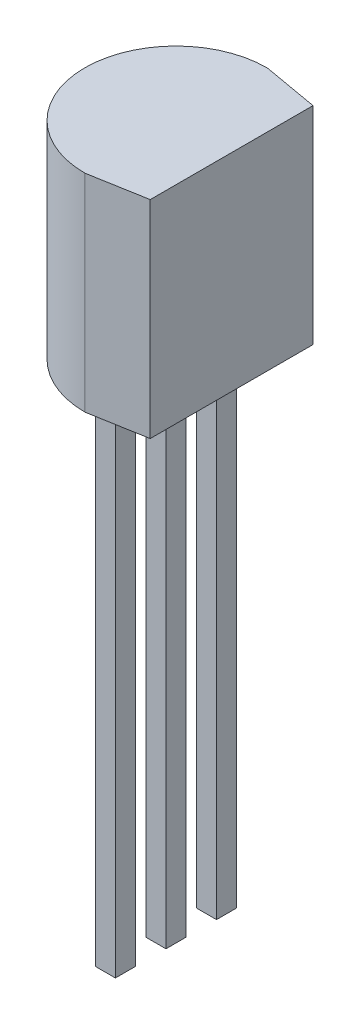
ISO-10303-21;
HEADER;
FILE_DESCRIPTION(('STEP AP214'),'2;1');
FILE_NAME('part.step','',(''),(''),'','','');
FILE_SCHEMA(('AUTOMOTIVE_DESIGN { 1 0 10303 214 1 1 1 1 }'));
ENDSEC;
DATA;
#1=APPLICATION_CONTEXT('core data for automotive mechanical design processes');
#2=APPLICATION_PROTOCOL_DEFINITION('international standard','automotive_design',2000,#1);
#3=PRODUCT_CONTEXT('',#1,'mechanical');
#4=PRODUCT('Part','Part','',(#3));
#5=PRODUCT_RELATED_PRODUCT_CATEGORY('part','',(#4));
#6=PRODUCT_DEFINITION_FORMATION('','',#4);
#7=PRODUCT_DEFINITION_CONTEXT('part definition',#1,'design');
#8=PRODUCT_DEFINITION('design','',#6,#7);
#9=PRODUCT_DEFINITION_SHAPE('','',#8);
#10=(LENGTH_UNIT() NAMED_UNIT(*) SI_UNIT(.MILLI.,.METRE.));
#11=(NAMED_UNIT(*) PLANE_ANGLE_UNIT() SI_UNIT($,.RADIAN.));
#12=(NAMED_UNIT(*) SI_UNIT($,.STERADIAN.) SOLID_ANGLE_UNIT());
#13=UNCERTAINTY_MEASURE_WITH_UNIT(LENGTH_MEASURE(1.E-05),#10,'distance_accuracy_value','');
#14=(GEOMETRIC_REPRESENTATION_CONTEXT(3) GLOBAL_UNCERTAINTY_ASSIGNED_CONTEXT((#13)) GLOBAL_UNIT_ASSIGNED_CONTEXT((#10,
#11,#12)) REPRESENTATION_CONTEXT('',''));
#15=CARTESIAN_POINT('',(0.,0.,0.));
#16=DIRECTION('',(0.,0.,1.));
#17=DIRECTION('',(1.,0.,0.));
#18=AXIS2_PLACEMENT_3D('',#15,#16,#17);
#19=CARTESIAN_POINT('',(0.,5.2,0.));
#20=DIRECTION('',(0.,-1.,0.));
#21=DIRECTION('',(0.,0.,-1.));
#22=AXIS2_PLACEMENT_3D('',#19,#20,#21);
#23=CYLINDRICAL_SURFACE('',#22,2.29);
#24=CARTESIAN_POINT('',(0.,0.,0.));
#25=DIRECTION('',(0.,1.,0.));
#26=DIRECTION('',(0.,0.,1.));
#27=AXIS2_PLACEMENT_3D('',#24,#25,#26);
#28=CIRCLE('',#27,2.29);
#29=CARTESIAN_POINT('',(0.,0.,-2.29));
#30=VERTEX_POINT('',#29);
#31=CARTESIAN_POINT('',(0.,0.,2.29));
#32=VERTEX_POINT('',#31);
#33=EDGE_CURVE('E298',#30,#32,#28,.T.);
#34=ORIENTED_EDGE('',*,*,#33,.T.);
#35=DIRECTION('',(0.,-1.,0.));
#36=VECTOR('',#35,1.);
#37=CARTESIAN_POINT('',(0.,5.2,2.29));
#38=LINE('',#37,#36);
#39=CARTESIAN_POINT('',(0.,5.2,2.29));
#40=VERTEX_POINT('',#39);
#41=EDGE_CURVE('E44',#40,#32,#38,.T.);
#42=ORIENTED_EDGE('',*,*,#41,.F.);
#43=CARTESIAN_POINT('',(0.,5.2,0.));
#44=DIRECTION('',(0.,1.,0.));
#45=DIRECTION('',(0.,0.,1.));
#46=AXIS2_PLACEMENT_3D('',#43,#44,#45);
#47=CIRCLE('',#46,2.29);
#48=CARTESIAN_POINT('',(0.,5.2,-2.29));
#49=VERTEX_POINT('',#48);
#50=EDGE_CURVE('E299',#49,#40,#47,.T.);
#51=ORIENTED_EDGE('',*,*,#50,.F.);
#52=DIRECTION('',(0.,-1.,0.));
#53=VECTOR('',#52,1.);
#54=CARTESIAN_POINT('',(0.,5.2,-2.29));
#55=LINE('',#54,#53);
#56=EDGE_CURVE('E11',#49,#30,#55,.T.);
#57=ORIENTED_EDGE('',*,*,#56,.T.);
#58=EDGE_LOOP('',(#34,#42,#51,#57));
#59=FACE_BOUND('',#58,.T.);
#60=ADVANCED_FACE('F37',(#59),#23,.T.);
#61=CARTESIAN_POINT('',(-5.1611850113347,5.2,0.));
#62=DIRECTION('',(0.,1.,0.));
#63=DIRECTION('',(0.,0.,1.));
#64=AXIS2_PLACEMENT_3D('',#61,#62,#63);
#65=PLANE('',#64);
#66=ORIENTED_EDGE('',*,*,#50,.T.);
#67=DIRECTION('',(1.,0.,0.));
#68=VECTOR('',#67,1.);
#69=CARTESIAN_POINT('',(-5.1611850113347,5.2,2.29));
#70=LINE('',#69,#68);
#71=CARTESIAN_POINT('',(0.0100000000000005,5.2,2.29));
#72=VERTEX_POINT('',#71);
#73=EDGE_CURVE('E273',#40,#72,#70,.T.);
#74=ORIENTED_EDGE('',*,*,#73,.T.);
#75=DIRECTION('',(0.984807753012208,0.,-0.17364817766693));
#76=VECTOR('',#75,1.);
#77=CARTESIAN_POINT('',(-4.61364163949441,5.2,3.10527277016999));
#78=LINE('',#77,#76);
#79=CARTESIAN_POINT('',(1.4,5.2,2.04490549681523));
#80=VERTEX_POINT('',#79);
#81=EDGE_CURVE('E275',#72,#80,#78,.T.);
#82=ORIENTED_EDGE('',*,*,#81,.T.);
#83=DIRECTION('',(0.,0.,1.));
#84=VECTOR('',#83,1.);
#85=CARTESIAN_POINT('',(1.4,5.2,0.));
#86=LINE('',#85,#84);
#87=CARTESIAN_POINT('',(1.4,5.2,-2.04490549681523));
#88=VERTEX_POINT('',#87);
#89=EDGE_CURVE('E263',#88,#80,#86,.T.);
#90=ORIENTED_EDGE('',*,*,#89,.F.);
#91=DIRECTION('',(0.984807753012208,0.,0.17364817766693));
#92=VECTOR('',#91,1.);
#93=CARTESIAN_POINT('',(-4.61364163949441,5.2,-3.10527277016999));
#94=LINE('',#93,#92);
#95=CARTESIAN_POINT('',(0.0100000000000005,5.2,-2.29));
#96=VERTEX_POINT('',#95);
#97=EDGE_CURVE('E266',#96,#88,#94,.T.);
#98=ORIENTED_EDGE('',*,*,#97,.F.);
#99=DIRECTION('',(1.,0.,0.));
#100=VECTOR('',#99,1.);
#101=CARTESIAN_POINT('',(-5.1611850113347,5.2,-2.29));
#102=LINE('',#101,#100);
#103=EDGE_CURVE('E270',#49,#96,#102,.T.);
#104=ORIENTED_EDGE('',*,*,#103,.F.);
#105=EDGE_LOOP('',(#66,#74,#82,#90,#98,#104));
#106=FACE_BOUND('',#105,.T.);
#107=ADVANCED_FACE('F321',(#106),#65,.T.);
#108=CARTESIAN_POINT('',(-5.1611850113347,0.,0.));
#109=DIRECTION('',(0.,1.,0.));
#110=DIRECTION('',(0.,0.,1.));
#111=AXIS2_PLACEMENT_3D('',#108,#109,#110);
#112=PLANE('',#111);
#113=DIRECTION('',(1.,0.,0.));
#114=VECTOR('',#113,1.);
#115=CARTESIAN_POINT('',(-0.444999999999998,0.,1.52));
#116=LINE('',#115,#114);
#117=CARTESIAN_POINT('',(-0.500000000000005,0.,1.52));
#118=VERTEX_POINT('',#117);
#119=CARTESIAN_POINT('',(0.,0.,1.52));
#120=VERTEX_POINT('',#119);
#121=EDGE_CURVE('E51',#118,#120,#116,.T.);
#122=ORIENTED_EDGE('',*,*,#121,.T.);
#123=DIRECTION('',(0.,0.,-1.));
#124=VECTOR('',#123,1.);
#125=CARTESIAN_POINT('',(0.,0.,-4.7161850113347));
#126=LINE('',#125,#124);
#127=CARTESIAN_POINT('',(0.,0.,1.02));
#128=VERTEX_POINT('',#127);
#129=EDGE_CURVE('E165',#120,#128,#126,.T.);
#130=ORIENTED_EDGE('',*,*,#129,.T.);
#131=DIRECTION('',(1.,0.,0.));
#132=VECTOR('',#131,1.);
#133=CARTESIAN_POINT('',(-0.444999999999998,0.,1.02));
#134=LINE('',#133,#132);
#135=CARTESIAN_POINT('',(-0.500000000000005,0.,1.02));
#136=VERTEX_POINT('',#135);
#137=EDGE_CURVE('E180',#136,#128,#134,.T.);
#138=ORIENTED_EDGE('',*,*,#137,.F.);
#139=DIRECTION('',(0.,0.,1.));
#140=VECTOR('',#139,1.);
#141=CARTESIAN_POINT('',(-0.500000000000004,0.,-4.7161850113347));
#142=LINE('',#141,#140);
#143=EDGE_CURVE('E56',#136,#118,#142,.T.);
#144=ORIENTED_EDGE('',*,*,#143,.T.);
#145=EDGE_LOOP('',(#122,#130,#138,#144));
#146=FACE_BOUND('',#145,.T.);
#147=DIRECTION('',(1.,0.,0.));
#148=VECTOR('',#147,1.);
#149=CARTESIAN_POINT('',(-0.444999999999998,0.,0.25));
#150=LINE('',#149,#148);
#151=CARTESIAN_POINT('',(-0.5,0.,0.25));
#152=VERTEX_POINT('',#151);
#153=CARTESIAN_POINT('',(0.,0.,0.25));
#154=VERTEX_POINT('',#153);
#155=EDGE_CURVE('E213',#152,#154,#150,.T.);
#156=ORIENTED_EDGE('',*,*,#155,.T.);
#157=DIRECTION('',(0.,0.,-1.));
#158=VECTOR('',#157,1.);
#159=CARTESIAN_POINT('',(0.,0.,-4.7161850113347));
#160=LINE('',#159,#158);
#161=CARTESIAN_POINT('',(0.,0.,-0.25));
#162=VERTEX_POINT('',#161);
#163=EDGE_CURVE('E168',#154,#162,#160,.T.);
#164=ORIENTED_EDGE('',*,*,#163,.T.);
#165=DIRECTION('',(1.,0.,0.));
#166=VECTOR('',#165,1.);
#167=CARTESIAN_POINT('',(-0.444999999999998,0.,-0.25));
#168=LINE('',#167,#166);
#169=CARTESIAN_POINT('',(-0.5,0.,-0.25));
#170=VERTEX_POINT('',#169);
#171=EDGE_CURVE('E203',#170,#162,#168,.T.);
#172=ORIENTED_EDGE('',*,*,#171,.F.);
#173=DIRECTION('',(0.,0.,1.));
#174=VECTOR('',#173,1.);
#175=CARTESIAN_POINT('',(-0.5,0.,-4.7161850113347));
#176=LINE('',#175,#174);
#177=EDGE_CURVE('E215',#170,#152,#176,.T.);
#178=ORIENTED_EDGE('',*,*,#177,.T.);
#179=EDGE_LOOP('',(#156,#164,#172,#178));
#180=FACE_BOUND('',#179,.T.);
#181=DIRECTION('',(1.,0.,0.));
#182=VECTOR('',#181,1.);
#183=CARTESIAN_POINT('',(-0.444999999999998,0.,-1.02));
#184=LINE('',#183,#182);
#185=CARTESIAN_POINT('',(-0.499999999999987,0.,-1.02));
#186=VERTEX_POINT('',#185);
#187=CARTESIAN_POINT('',(0.,0.,-1.02));
#188=VERTEX_POINT('',#187);
#189=EDGE_CURVE('E245',#186,#188,#184,.T.);
#190=ORIENTED_EDGE('',*,*,#189,.T.);
#191=DIRECTION('',(0.,0.,-1.));
#192=VECTOR('',#191,1.);
#193=CARTESIAN_POINT('',(0.,0.,-4.7161850113347));
#194=LINE('',#193,#192);
#195=CARTESIAN_POINT('',(0.,0.,-1.52));
#196=VERTEX_POINT('',#195);
#197=EDGE_CURVE('E230',#188,#196,#194,.T.);
#198=ORIENTED_EDGE('',*,*,#197,.T.);
#199=DIRECTION('',(1.,0.,0.));
#200=VECTOR('',#199,1.);
#201=CARTESIAN_POINT('',(-0.444999999999998,0.,-1.52));
#202=LINE('',#201,#200);
#203=CARTESIAN_POINT('',(-0.499999999999987,0.,-1.52));
#204=VERTEX_POINT('',#203);
#205=EDGE_CURVE('E235',#204,#196,#202,.T.);
#206=ORIENTED_EDGE('',*,*,#205,.F.);
#207=DIRECTION('',(0.,0.,1.));
#208=VECTOR('',#207,1.);
#209=CARTESIAN_POINT('',(-0.499999999999987,0.,-4.7161850113347));
#210=LINE('',#209,#208);
#211=EDGE_CURVE('E247',#204,#186,#210,.T.);
#212=ORIENTED_EDGE('',*,*,#211,.T.);
#213=EDGE_LOOP('',(#190,#198,#206,#212));
#214=FACE_BOUND('',#213,.T.);
#215=ORIENTED_EDGE('',*,*,#33,.F.);
#216=DIRECTION('',(1.,0.,0.));
#217=VECTOR('',#216,1.);
#218=CARTESIAN_POINT('',(-5.1611850113347,0.,-2.29));
#219=LINE('',#218,#217);
#220=CARTESIAN_POINT('',(0.0100000000000005,0.,-2.29));
#221=VERTEX_POINT('',#220);
#222=EDGE_CURVE('E283',#30,#221,#219,.T.);
#223=ORIENTED_EDGE('',*,*,#222,.T.);
#224=DIRECTION('',(0.984807753012208,0.,0.17364817766693));
#225=VECTOR('',#224,1.);
#226=CARTESIAN_POINT('',(-4.61364163949441,0.,-3.10527277016999));
#227=LINE('',#226,#225);
#228=CARTESIAN_POINT('',(1.4,0.,-2.04490549681523));
#229=VERTEX_POINT('',#228);
#230=EDGE_CURVE('E280',#221,#229,#227,.T.);
#231=ORIENTED_EDGE('',*,*,#230,.T.);
#232=DIRECTION('',(0.,0.,1.));
#233=VECTOR('',#232,1.);
#234=CARTESIAN_POINT('',(1.4,0.,0.));
#235=LINE('',#234,#233);
#236=CARTESIAN_POINT('',(1.4,0.,2.04490549681523));
#237=VERTEX_POINT('',#236);
#238=EDGE_CURVE('E262',#229,#237,#235,.T.);
#239=ORIENTED_EDGE('',*,*,#238,.T.);
#240=DIRECTION('',(0.984807753012208,0.,-0.17364817766693));
#241=VECTOR('',#240,1.);
#242=CARTESIAN_POINT('',(-4.61364163949441,0.,3.10527277016999));
#243=LINE('',#242,#241);
#244=CARTESIAN_POINT('',(0.0100000000000005,0.,2.29));
#245=VERTEX_POINT('',#244);
#246=EDGE_CURVE('E267',#245,#237,#243,.T.);
#247=ORIENTED_EDGE('',*,*,#246,.F.);
#248=DIRECTION('',(1.,0.,0.));
#249=VECTOR('',#248,1.);
#250=CARTESIAN_POINT('',(-5.1611850113347,0.,2.29));
#251=LINE('',#250,#249);
#252=EDGE_CURVE('E286',#32,#245,#251,.T.);
#253=ORIENTED_EDGE('',*,*,#252,.F.);
#254=EDGE_LOOP('',(#215,#223,#231,#239,#247,#253));
#255=FACE_BOUND('',#254,.T.);
#256=ADVANCED_FACE('F312',(#146,#180,#214,#255),#112,.F.);
#257=CARTESIAN_POINT('',(1.4,5.2,0.));
#258=DIRECTION('',(1.,0.,0.));
#259=DIRECTION('',(0.,0.,-1.));
#260=AXIS2_PLACEMENT_3D('',#257,#258,#259);
#261=PLANE('',#260);
#262=ORIENTED_EDGE('',*,*,#238,.F.);
#263=DIRECTION('',(0.,-1.,0.));
#264=VECTOR('',#263,1.);
#265=CARTESIAN_POINT('',(1.4,5.2,-2.04490549681523));
#266=LINE('',#265,#264);
#267=EDGE_CURVE('E296',#88,#229,#266,.T.);
#268=ORIENTED_EDGE('',*,*,#267,.F.);
#269=ORIENTED_EDGE('',*,*,#89,.T.);
#270=DIRECTION('',(0.,-1.,0.));
#271=VECTOR('',#270,1.);
#272=CARTESIAN_POINT('',(1.4,5.2,2.04490549681523));
#273=LINE('',#272,#271);
#274=EDGE_CURVE('E277',#80,#237,#273,.T.);
#275=ORIENTED_EDGE('',*,*,#274,.T.);
#276=EDGE_LOOP('',(#262,#268,#269,#275));
#277=FACE_BOUND('',#276,.T.);
#278=ADVANCED_FACE('F330',(#277),#261,.T.);
#279=CARTESIAN_POINT('',(-4.61364163949441,5.2,-3.10527277016999));
#280=DIRECTION('',(0.17364817766693,0.,-0.984807753012208));
#281=DIRECTION('',(-0.984807753012208,0.,-0.17364817766693));
#282=AXIS2_PLACEMENT_3D('',#279,#280,#281);
#283=PLANE('',#282);
#284=ORIENTED_EDGE('',*,*,#230,.F.);
#285=DIRECTION('',(0.,-1.,0.));
#286=VECTOR('',#285,1.);
#287=CARTESIAN_POINT('',(0.0100000000000005,5.2,-2.29));
#288=LINE('',#287,#286);
#289=EDGE_CURVE('E294',#96,#221,#288,.T.);
#290=ORIENTED_EDGE('',*,*,#289,.F.);
#291=ORIENTED_EDGE('',*,*,#97,.T.);
#292=ORIENTED_EDGE('',*,*,#267,.T.);
#293=EDGE_LOOP('',(#284,#290,#291,#292));
#294=FACE_BOUND('',#293,.T.);
#295=ADVANCED_FACE('F328',(#294),#283,.T.);
#296=CARTESIAN_POINT('',(-5.1611850113347,5.2,-2.29));
#297=DIRECTION('',(0.,0.,-1.));
#298=DIRECTION('',(-1.,0.,0.));
#299=AXIS2_PLACEMENT_3D('',#296,#297,#298);
#300=PLANE('',#299);
#301=ORIENTED_EDGE('',*,*,#222,.F.);
#302=ORIENTED_EDGE('',*,*,#56,.F.);
#303=ORIENTED_EDGE('',*,*,#103,.T.);
#304=ORIENTED_EDGE('',*,*,#289,.T.);
#305=EDGE_LOOP('',(#301,#302,#303,#304));
#306=FACE_BOUND('',#305,.T.);
#307=ADVANCED_FACE('F325',(#306),#300,.T.);
#308=CARTESIAN_POINT('',(-5.1611850113347,5.2,2.29));
#309=DIRECTION('',(0.,0.,-1.));
#310=DIRECTION('',(-1.,0.,0.));
#311=AXIS2_PLACEMENT_3D('',#308,#309,#310);
#312=PLANE('',#311);
#313=ORIENTED_EDGE('',*,*,#252,.T.);
#314=DIRECTION('',(0.,-1.,0.));
#315=VECTOR('',#314,1.);
#316=CARTESIAN_POINT('',(0.0100000000000005,5.2,2.29));
#317=LINE('',#316,#315);
#318=EDGE_CURVE('E291',#72,#245,#317,.T.);
#319=ORIENTED_EDGE('',*,*,#318,.F.);
#320=ORIENTED_EDGE('',*,*,#73,.F.);
#321=ORIENTED_EDGE('',*,*,#41,.T.);
#322=EDGE_LOOP('',(#313,#319,#320,#321));
#323=FACE_BOUND('',#322,.T.);
#324=ADVANCED_FACE('F306',(#323),#312,.F.);
#325=CARTESIAN_POINT('',(-4.61364163949441,5.2,3.10527277016999));
#326=DIRECTION('',(-0.17364817766693,0.,-0.984807753012208));
#327=DIRECTION('',(-0.984807753012208,0.,0.17364817766693));
#328=AXIS2_PLACEMENT_3D('',#325,#326,#327);
#329=PLANE('',#328);
#330=ORIENTED_EDGE('',*,*,#246,.T.);
#331=ORIENTED_EDGE('',*,*,#274,.F.);
#332=ORIENTED_EDGE('',*,*,#81,.F.);
#333=ORIENTED_EDGE('',*,*,#318,.T.);
#334=EDGE_LOOP('',(#330,#331,#332,#333));
#335=FACE_BOUND('',#334,.T.);
#336=ADVANCED_FACE('F317',(#335),#329,.F.);
#337=CARTESIAN_POINT('',(0.,-12.7,-4.7161850113347));
#338=DIRECTION('',(1.,0.,0.));
#339=DIRECTION('',(0.,0.,-1.));
#340=AXIS2_PLACEMENT_3D('',#337,#338,#339);
#341=PLANE('',#340);
#342=ORIENTED_EDGE('',*,*,#197,.F.);
#343=DIRECTION('',(0.,1.,0.));
#344=VECTOR('',#343,1.);
#345=CARTESIAN_POINT('',(0.,-12.7,-1.02));
#346=LINE('',#345,#344);
#347=CARTESIAN_POINT('',(0.,-12.7,-1.02));
#348=VERTEX_POINT('',#347);
#349=EDGE_CURVE('E259',#348,#188,#346,.T.);
#350=ORIENTED_EDGE('',*,*,#349,.F.);
#351=DIRECTION('',(0.,0.,-1.));
#352=VECTOR('',#351,1.);
#353=CARTESIAN_POINT('',(0.,-12.7,-4.7161850113347));
#354=LINE('',#353,#352);
#355=CARTESIAN_POINT('',(0.,-12.7,-1.52));
#356=VERTEX_POINT('',#355);
#357=EDGE_CURVE('E231',#348,#356,#354,.T.);
#358=ORIENTED_EDGE('',*,*,#357,.T.);
#359=DIRECTION('',(0.,1.,0.));
#360=VECTOR('',#359,1.);
#361=CARTESIAN_POINT('',(0.,-12.7,-1.52));
#362=LINE('',#361,#360);
#363=EDGE_CURVE('E243',#356,#196,#362,.T.);
#364=ORIENTED_EDGE('',*,*,#363,.T.);
#365=EDGE_LOOP('',(#342,#350,#358,#364));
#366=FACE_BOUND('',#365,.T.);
#367=ADVANCED_FACE('F361',(#366),#341,.T.);
#368=CARTESIAN_POINT('',(-0.444999999999998,-12.7,-1.02));
#369=DIRECTION('',(0.,0.,1.));
#370=DIRECTION('',(1.,0.,0.));
#371=AXIS2_PLACEMENT_3D('',#368,#369,#370);
#372=PLANE('',#371);
#373=ORIENTED_EDGE('',*,*,#189,.F.);
#374=DIRECTION('',(0.,1.,0.));
#375=VECTOR('',#374,1.);
#376=CARTESIAN_POINT('',(-0.499999999999987,-12.7,-1.02));
#377=LINE('',#376,#375);
#378=CARTESIAN_POINT('',(-0.499999999999987,-12.7,-1.02));
#379=VERTEX_POINT('',#378);
#380=EDGE_CURVE('E256',#379,#186,#377,.T.);
#381=ORIENTED_EDGE('',*,*,#380,.F.);
#382=DIRECTION('',(1.,0.,0.));
#383=VECTOR('',#382,1.);
#384=CARTESIAN_POINT('',(-0.444999999999998,-12.7,-1.02));
#385=LINE('',#384,#383);
#386=EDGE_CURVE('E234',#379,#348,#385,.T.);
#387=ORIENTED_EDGE('',*,*,#386,.T.);
#388=ORIENTED_EDGE('',*,*,#349,.T.);
#389=EDGE_LOOP('',(#373,#381,#387,#388));
#390=FACE_BOUND('',#389,.T.);
#391=ADVANCED_FACE('F366',(#390),#372,.T.);
#392=CARTESIAN_POINT('',(-0.499999999999987,-12.7,-4.7161850113347));
#393=DIRECTION('',(-1.,0.,0.));
#394=DIRECTION('',(0.,0.,1.));
#395=AXIS2_PLACEMENT_3D('',#392,#393,#394);
#396=PLANE('',#395);
#397=ORIENTED_EDGE('',*,*,#211,.F.);
#398=DIRECTION('',(0.,1.,0.));
#399=VECTOR('',#398,1.);
#400=CARTESIAN_POINT('',(-0.499999999999987,-12.7,-1.52));
#401=LINE('',#400,#399);
#402=CARTESIAN_POINT('',(-0.499999999999987,-12.7,-1.52));
#403=VERTEX_POINT('',#402);
#404=EDGE_CURVE('E253',#403,#204,#401,.T.);
#405=ORIENTED_EDGE('',*,*,#404,.F.);
#406=DIRECTION('',(0.,0.,1.));
#407=VECTOR('',#406,1.);
#408=CARTESIAN_POINT('',(-0.499999999999987,-12.7,-4.7161850113347));
#409=LINE('',#408,#407);
#410=EDGE_CURVE('E238',#403,#379,#409,.T.);
#411=ORIENTED_EDGE('',*,*,#410,.T.);
#412=ORIENTED_EDGE('',*,*,#380,.T.);
#413=EDGE_LOOP('',(#397,#405,#411,#412));
#414=FACE_BOUND('',#413,.T.);
#415=ADVANCED_FACE('F376',(#414),#396,.T.);
#416=CARTESIAN_POINT('',(-0.444999999999998,-12.7,-1.52));
#417=DIRECTION('',(0.,0.,1.));
#418=DIRECTION('',(1.,0.,0.));
#419=AXIS2_PLACEMENT_3D('',#416,#417,#418);
#420=PLANE('',#419);
#421=ORIENTED_EDGE('',*,*,#205,.T.);
#422=ORIENTED_EDGE('',*,*,#363,.F.);
#423=DIRECTION('',(1.,0.,0.));
#424=VECTOR('',#423,1.);
#425=CARTESIAN_POINT('',(-0.444999999999998,-12.7,-1.52));
#426=LINE('',#425,#424);
#427=EDGE_CURVE('E241',#403,#356,#426,.T.);
#428=ORIENTED_EDGE('',*,*,#427,.F.);
#429=ORIENTED_EDGE('',*,*,#404,.T.);
#430=EDGE_LOOP('',(#421,#422,#428,#429));
#431=FACE_BOUND('',#430,.T.);
#432=ADVANCED_FACE('F387',(#431),#420,.F.);
#433=CARTESIAN_POINT('',(-0.444999999999998,-12.7,-4.7161850113347));
#434=DIRECTION('',(0.,-1.,0.));
#435=DIRECTION('',(0.,0.,-1.));
#436=AXIS2_PLACEMENT_3D('',#433,#434,#435);
#437=PLANE('',#436);
#438=ORIENTED_EDGE('',*,*,#357,.F.);
#439=ORIENTED_EDGE('',*,*,#386,.F.);
#440=ORIENTED_EDGE('',*,*,#410,.F.);
#441=ORIENTED_EDGE('',*,*,#427,.T.);
#442=EDGE_LOOP('',(#438,#439,#440,#441));
#443=FACE_BOUND('',#442,.T.);
#444=ADVANCED_FACE('F399',(#443),#437,.T.);
#445=CARTESIAN_POINT('',(0.,-12.7,-4.7161850113347));
#446=DIRECTION('',(1.,0.,0.));
#447=DIRECTION('',(0.,0.,-1.));
#448=AXIS2_PLACEMENT_3D('',#445,#446,#447);
#449=PLANE('',#448);
#450=ORIENTED_EDGE('',*,*,#163,.F.);
#451=DIRECTION('',(0.,1.,0.));
#452=VECTOR('',#451,1.);
#453=CARTESIAN_POINT('',(0.,-12.7,0.25));
#454=LINE('',#453,#452);
#455=CARTESIAN_POINT('',(0.,-12.7,0.25));
#456=VERTEX_POINT('',#455);
#457=EDGE_CURVE('E227',#456,#154,#454,.T.);
#458=ORIENTED_EDGE('',*,*,#457,.F.);
#459=DIRECTION('',(0.,0.,-1.));
#460=VECTOR('',#459,1.);
#461=CARTESIAN_POINT('',(0.,-12.7,-4.7161850113347));
#462=LINE('',#461,#460);
#463=CARTESIAN_POINT('',(0.,-12.7,-0.25));
#464=VERTEX_POINT('',#463);
#465=EDGE_CURVE('E199',#456,#464,#462,.T.);
#466=ORIENTED_EDGE('',*,*,#465,.T.);
#467=DIRECTION('',(0.,1.,0.));
#468=VECTOR('',#467,1.);
#469=CARTESIAN_POINT('',(0.,-12.7,-0.25));
#470=LINE('',#469,#468);
#471=EDGE_CURVE('E211',#464,#162,#470,.T.);
#472=ORIENTED_EDGE('',*,*,#471,.T.);
#473=EDGE_LOOP('',(#450,#458,#466,#472));
#474=FACE_BOUND('',#473,.T.);
#475=ADVANCED_FACE('F409',(#474),#449,.T.);
#476=CARTESIAN_POINT('',(-0.444999999999998,-12.7,0.25));
#477=DIRECTION('',(0.,0.,1.));
#478=DIRECTION('',(1.,0.,0.));
#479=AXIS2_PLACEMENT_3D('',#476,#477,#478);
#480=PLANE('',#479);
#481=ORIENTED_EDGE('',*,*,#155,.F.);
#482=DIRECTION('',(0.,1.,0.));
#483=VECTOR('',#482,1.);
#484=CARTESIAN_POINT('',(-0.5,-12.7,0.25));
#485=LINE('',#484,#483);
#486=CARTESIAN_POINT('',(-0.5,-12.7,0.25));
#487=VERTEX_POINT('',#486);
#488=EDGE_CURVE('E224',#487,#152,#485,.T.);
#489=ORIENTED_EDGE('',*,*,#488,.F.);
#490=DIRECTION('',(1.,0.,0.));
#491=VECTOR('',#490,1.);
#492=CARTESIAN_POINT('',(-0.444999999999998,-12.7,0.25));
#493=LINE('',#492,#491);
#494=EDGE_CURVE('E202',#487,#456,#493,.T.);
#495=ORIENTED_EDGE('',*,*,#494,.T.);
#496=ORIENTED_EDGE('',*,*,#457,.T.);
#497=EDGE_LOOP('',(#481,#489,#495,#496));
#498=FACE_BOUND('',#497,.T.);
#499=ADVANCED_FACE('F419',(#498),#480,.T.);
#500=CARTESIAN_POINT('',(-0.5,-12.7,-4.7161850113347));
#501=DIRECTION('',(-1.,0.,0.));
#502=DIRECTION('',(0.,0.,1.));
#503=AXIS2_PLACEMENT_3D('',#500,#501,#502);
#504=PLANE('',#503);
#505=ORIENTED_EDGE('',*,*,#177,.F.);
#506=DIRECTION('',(0.,1.,0.));
#507=VECTOR('',#506,1.);
#508=CARTESIAN_POINT('',(-0.5,-12.7,-0.25));
#509=LINE('',#508,#507);
#510=CARTESIAN_POINT('',(-0.5,-12.7,-0.25));
#511=VERTEX_POINT('',#510);
#512=EDGE_CURVE('E221',#511,#170,#509,.T.);
#513=ORIENTED_EDGE('',*,*,#512,.F.);
#514=DIRECTION('',(0.,0.,1.));
#515=VECTOR('',#514,1.);
#516=CARTESIAN_POINT('',(-0.5,-12.7,-4.7161850113347));
#517=LINE('',#516,#515);
#518=EDGE_CURVE('E206',#511,#487,#517,.T.);
#519=ORIENTED_EDGE('',*,*,#518,.T.);
#520=ORIENTED_EDGE('',*,*,#488,.T.);
#521=EDGE_LOOP('',(#505,#513,#519,#520));
#522=FACE_BOUND('',#521,.T.);
#523=ADVANCED_FACE('F429',(#522),#504,.T.);
#524=CARTESIAN_POINT('',(-0.444999999999998,-12.7,-0.25));
#525=DIRECTION('',(0.,0.,1.));
#526=DIRECTION('',(1.,0.,0.));
#527=AXIS2_PLACEMENT_3D('',#524,#525,#526);
#528=PLANE('',#527);
#529=ORIENTED_EDGE('',*,*,#171,.T.);
#530=ORIENTED_EDGE('',*,*,#471,.F.);
#531=DIRECTION('',(1.,0.,0.));
#532=VECTOR('',#531,1.);
#533=CARTESIAN_POINT('',(-0.444999999999998,-12.7,-0.25));
#534=LINE('',#533,#532);
#535=EDGE_CURVE('E209',#511,#464,#534,.T.);
#536=ORIENTED_EDGE('',*,*,#535,.F.);
#537=ORIENTED_EDGE('',*,*,#512,.T.);
#538=EDGE_LOOP('',(#529,#530,#536,#537));
#539=FACE_BOUND('',#538,.T.);
#540=ADVANCED_FACE('F440',(#539),#528,.F.);
#541=CARTESIAN_POINT('',(-0.444999999999998,-12.7,-4.7161850113347));
#542=DIRECTION('',(0.,-1.,0.));
#543=DIRECTION('',(0.,0.,-1.));
#544=AXIS2_PLACEMENT_3D('',#541,#542,#543);
#545=PLANE('',#544);
#546=ORIENTED_EDGE('',*,*,#465,.F.);
#547=ORIENTED_EDGE('',*,*,#494,.F.);
#548=ORIENTED_EDGE('',*,*,#518,.F.);
#549=ORIENTED_EDGE('',*,*,#535,.T.);
#550=EDGE_LOOP('',(#546,#547,#548,#549));
#551=FACE_BOUND('',#550,.T.);
#552=ADVANCED_FACE('F452',(#551),#545,.T.);
#553=CARTESIAN_POINT('',(0.,-12.7,-4.7161850113347));
#554=DIRECTION('',(1.,0.,0.));
#555=DIRECTION('',(0.,0.,-1.));
#556=AXIS2_PLACEMENT_3D('',#553,#554,#555);
#557=PLANE('',#556);
#558=ORIENTED_EDGE('',*,*,#129,.F.);
#559=DIRECTION('',(0.,1.,0.));
#560=VECTOR('',#559,1.);
#561=CARTESIAN_POINT('',(0.,-12.7,1.52));
#562=LINE('',#561,#560);
#563=CARTESIAN_POINT('',(0.,-12.7,1.52));
#564=VERTEX_POINT('',#563);
#565=EDGE_CURVE('E160',#564,#120,#562,.T.);
#566=ORIENTED_EDGE('',*,*,#565,.F.);
#567=DIRECTION('',(0.,0.,-1.));
#568=VECTOR('',#567,1.);
#569=CARTESIAN_POINT('',(0.,-12.7,-4.7161850113347));
#570=LINE('',#569,#568);
#571=CARTESIAN_POINT('',(0.,-12.7,1.02));
#572=VERTEX_POINT('',#571);
#573=EDGE_CURVE('E164',#564,#572,#570,.T.);
#574=ORIENTED_EDGE('',*,*,#573,.T.);
#575=DIRECTION('',(0.,1.,0.));
#576=VECTOR('',#575,1.);
#577=CARTESIAN_POINT('',(0.,-12.7,1.02));
#578=LINE('',#577,#576);
#579=EDGE_CURVE('E188',#572,#128,#578,.T.);
#580=ORIENTED_EDGE('',*,*,#579,.T.);
#581=EDGE_LOOP('',(#558,#566,#574,#580));
#582=FACE_BOUND('',#581,.T.);
#583=ADVANCED_FACE('F162',(#582),#557,.T.);
#584=CARTESIAN_POINT('',(-0.444999999999998,-12.7,1.52));
#585=DIRECTION('',(0.,0.,1.));
#586=DIRECTION('',(1.,0.,0.));
#587=AXIS2_PLACEMENT_3D('',#584,#585,#586);
#588=PLANE('',#587);
#589=ORIENTED_EDGE('',*,*,#121,.F.);
#590=DIRECTION('',(0.,1.,0.));
#591=VECTOR('',#590,1.);
#592=CARTESIAN_POINT('',(-0.500000000000004,-12.7,1.52));
#593=LINE('',#592,#591);
#594=CARTESIAN_POINT('',(-0.500000000000004,-12.7,1.52));
#595=VERTEX_POINT('',#594);
#596=EDGE_CURVE('E169',#595,#118,#593,.T.);
#597=ORIENTED_EDGE('',*,*,#596,.F.);
#598=DIRECTION('',(1.,0.,0.));
#599=VECTOR('',#598,1.);
#600=CARTESIAN_POINT('',(-0.444999999999998,-12.7,1.52));
#601=LINE('',#600,#599);
#602=EDGE_CURVE('E175',#595,#564,#601,.T.);
#603=ORIENTED_EDGE('',*,*,#602,.T.);
#604=ORIENTED_EDGE('',*,*,#565,.T.);
#605=EDGE_LOOP('',(#589,#597,#603,#604));
#606=FACE_BOUND('',#605,.T.);
#607=ADVANCED_FACE('F182',(#606),#588,.T.);
#608=CARTESIAN_POINT('',(-0.500000000000004,-12.7,-4.7161850113347));
#609=DIRECTION('',(-1.,0.,0.));
#610=DIRECTION('',(0.,0.,1.));
#611=AXIS2_PLACEMENT_3D('',#608,#609,#610);
#612=PLANE('',#611);
#613=ORIENTED_EDGE('',*,*,#143,.F.);
#614=DIRECTION('',(0.,1.,0.));
#615=VECTOR('',#614,1.);
#616=CARTESIAN_POINT('',(-0.500000000000004,-12.7,1.02));
#617=LINE('',#616,#615);
#618=CARTESIAN_POINT('',(-0.500000000000004,-12.7,1.02));
#619=VERTEX_POINT('',#618);
#620=EDGE_CURVE('E195',#619,#136,#617,.T.);
#621=ORIENTED_EDGE('',*,*,#620,.F.);
#622=DIRECTION('',(0.,0.,1.));
#623=VECTOR('',#622,1.);
#624=CARTESIAN_POINT('',(-0.500000000000004,-12.7,-4.7161850113347));
#625=LINE('',#624,#623);
#626=EDGE_CURVE('E183',#619,#595,#625,.T.);
#627=ORIENTED_EDGE('',*,*,#626,.T.);
#628=ORIENTED_EDGE('',*,*,#596,.T.);
#629=EDGE_LOOP('',(#613,#621,#627,#628));
#630=FACE_BOUND('',#629,.T.);
#631=ADVANCED_FACE('F479',(#630),#612,.T.);
#632=CARTESIAN_POINT('',(-0.444999999999998,-12.7,1.02));
#633=DIRECTION('',(0.,0.,1.));
#634=DIRECTION('',(1.,0.,0.));
#635=AXIS2_PLACEMENT_3D('',#632,#633,#634);
#636=PLANE('',#635);
#637=ORIENTED_EDGE('',*,*,#137,.T.);
#638=ORIENTED_EDGE('',*,*,#579,.F.);
#639=DIRECTION('',(1.,0.,0.));
#640=VECTOR('',#639,1.);
#641=CARTESIAN_POINT('',(-0.444999999999998,-12.7,1.02));
#642=LINE('',#641,#640);
#643=EDGE_CURVE('E178',#619,#572,#642,.T.);
#644=ORIENTED_EDGE('',*,*,#643,.F.);
#645=ORIENTED_EDGE('',*,*,#620,.T.);
#646=EDGE_LOOP('',(#637,#638,#644,#645));
#647=FACE_BOUND('',#646,.T.);
#648=ADVANCED_FACE('F489',(#647),#636,.F.);
#649=CARTESIAN_POINT('',(-0.444999999999998,-12.7,-4.7161850113347));
#650=DIRECTION('',(0.,-1.,0.));
#651=DIRECTION('',(0.,0.,-1.));
#652=AXIS2_PLACEMENT_3D('',#649,#650,#651);
#653=PLANE('',#652);
#654=ORIENTED_EDGE('',*,*,#573,.F.);
#655=ORIENTED_EDGE('',*,*,#602,.F.);
#656=ORIENTED_EDGE('',*,*,#626,.F.);
#657=ORIENTED_EDGE('',*,*,#643,.T.);
#658=EDGE_LOOP('',(#654,#655,#656,#657));
#659=FACE_BOUND('',#658,.T.);
#660=ADVANCED_FACE('F173',(#659),#653,.T.);
#661=CLOSED_SHELL('',(#60,#107,#256,#278,#295,#307,#324,#336,#367,#391,#415,#432,#444,#475,#499,
#523,#540,#552,#583,#607,#631,#648,#660));
#662=MANIFOLD_SOLID_BREP('B2',#661);
#663=ADVANCED_BREP_SHAPE_REPRESENTATION('',(#18,#662),#14);
#664=SHAPE_DEFINITION_REPRESENTATION(#9,#663);
ENDSEC;
END-ISO-10303-21;
